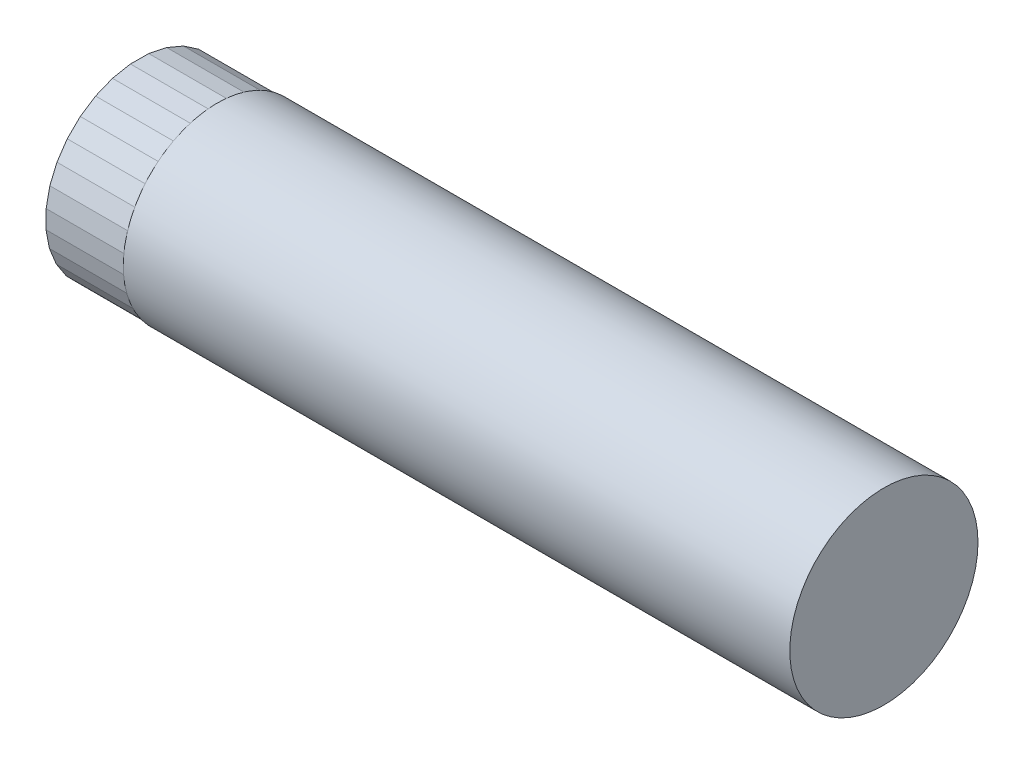
ISO-10303-21;
HEADER;
FILE_DESCRIPTION(('STEP AP214'),'2;1');
FILE_NAME('part.step','',(''),(''),'','','');
FILE_SCHEMA(('AUTOMOTIVE_DESIGN { 1 0 10303 214 1 1 1 1 }'));
ENDSEC;
DATA;
#1=APPLICATION_CONTEXT('core data for automotive mechanical design processes');
#2=APPLICATION_PROTOCOL_DEFINITION('international standard','automotive_design',2000,#1);
#3=PRODUCT_CONTEXT('',#1,'mechanical');
#4=PRODUCT('Part','Part','',(#3));
#5=PRODUCT_RELATED_PRODUCT_CATEGORY('part','',(#4));
#6=PRODUCT_DEFINITION_FORMATION('','',#4);
#7=PRODUCT_DEFINITION_CONTEXT('part definition',#1,'design');
#8=PRODUCT_DEFINITION('design','',#6,#7);
#9=PRODUCT_DEFINITION_SHAPE('','',#8);
#10=(LENGTH_UNIT() NAMED_UNIT(*) SI_UNIT(.MILLI.,.METRE.));
#11=(NAMED_UNIT(*) PLANE_ANGLE_UNIT() SI_UNIT($,.RADIAN.));
#12=(NAMED_UNIT(*) SI_UNIT($,.STERADIAN.) SOLID_ANGLE_UNIT());
#13=UNCERTAINTY_MEASURE_WITH_UNIT(LENGTH_MEASURE(1.E-05),#10,'distance_accuracy_value','');
#14=(GEOMETRIC_REPRESENTATION_CONTEXT(3) GLOBAL_UNCERTAINTY_ASSIGNED_CONTEXT((#13)) GLOBAL_UNIT_ASSIGNED_CONTEXT((#10,
#11,#12)) REPRESENTATION_CONTEXT('',''));
#15=CARTESIAN_POINT('',(0.,0.,0.));
#16=DIRECTION('',(0.,0.,1.));
#17=DIRECTION('',(1.,0.,0.));
#18=AXIS2_PLACEMENT_3D('',#15,#16,#17);
#19=CARTESIAN_POINT('',(0.,0.,0.));
#20=DIRECTION('',(1.,0.,0.));
#21=DIRECTION('',(0.,0.,-1.));
#22=AXIS2_PLACEMENT_3D('',#19,#20,#21);
#23=PLANE('',#22);
#24=CARTESIAN_POINT('',(0.,0.,0.));
#25=DIRECTION('',(1.,0.,0.));
#26=DIRECTION('',(0.,0.,-1.));
#27=AXIS2_PLACEMENT_3D('',#24,#25,#26);
#28=CIRCLE('',#27,6.);
#29=CARTESIAN_POINT('',(0.,0.,-6.));
#30=VERTEX_POINT('',#29);
#31=EDGE_CURVE('E45',#30,#30,#28,.T.);
#32=ORIENTED_EDGE('',*,*,#31,.F.);
#33=EDGE_LOOP('',(#32));
#34=FACE_BOUND('',#33,.T.);
#35=DIRECTION('',(0.,-0.979272733016625,0.202546079621773));
#36=VECTOR('',#35,1.);
#37=CARTESIAN_POINT('',(0.,-0.627894725384753,-5.9135621876609));
#38=LINE('',#37,#36);
#39=CARTESIAN_POINT('',(0.,-0.627894725384753,-5.9135621876609));
#40=VERTEX_POINT('',#39);
#41=CARTESIAN_POINT('',(0.,-1.76950865575336,-5.6774385642394));
#42=VERTEX_POINT('',#41);
#43=EDGE_CURVE('E270',#40,#42,#38,.T.);
#44=ORIENTED_EDGE('',*,*,#43,.F.);
#45=DIRECTION('',(0.,-0.999971061939465,0.00760758067058654));
#46=VECTOR('',#45,1.);
#47=CARTESIAN_POINT('',(0.,0.537848847152972,-5.92243093257448));
#48=LINE('',#47,#46);
#49=CARTESIAN_POINT('',(0.,0.537848847152972,-5.92243093257448));
#50=VERTEX_POINT('',#49);
#51=EDGE_CURVE('E267',#50,#40,#48,.T.);
#52=ORIENTED_EDGE('',*,*,#51,.F.);
#53=DIRECTION('',(0.,-0.982241063742202,-0.187623273339388));
#54=VECTOR('',#53,1.);
#55=CARTESIAN_POINT('',(0.,1.68292319012372,-5.70370397808675));
#56=LINE('',#55,#54);
#57=CARTESIAN_POINT('',(0.,1.68292319012372,-5.70370397808675));
#58=VERTEX_POINT('',#57);
#59=EDGE_CURVE('E366',#58,#50,#56,.T.);
#60=ORIENTED_EDGE('',*,*,#59,.F.);
#61=DIRECTION('',(0.,-0.926764092312462,-0.375643870175273));
#62=VECTOR('',#61,1.);
#63=CARTESIAN_POINT('',(0.,2.7633237386922,-5.26578687839519));
#64=LINE('',#63,#62);
#65=CARTESIAN_POINT('',(0.,2.7633237386922,-5.26578687839519));
#66=VERTEX_POINT('',#65);
#67=EDGE_CURVE('E369',#66,#58,#64,.T.);
#68=ORIENTED_EDGE('',*,*,#67,.F.);
#69=DIRECTION('',(0.,-0.835672096550445,-0.549228683743833));
#70=VECTOR('',#69,1.);
#71=CARTESIAN_POINT('',(0.,3.73753130567255,-4.62550854205421));
#72=LINE('',#71,#70);
#73=CARTESIAN_POINT('',(0.,3.73753130567255,-4.62550854205421));
#74=VERTEX_POINT('',#73);
#75=EDGE_CURVE('E372',#74,#66,#72,.T.);
#76=ORIENTED_EDGE('',*,*,#75,.F.);
#77=DIRECTION('',(0.,-0.712465690768305,-0.701706947007112));
#78=VECTOR('',#77,1.);
#79=CARTESIAN_POINT('',(0.,4.56810764060761,-3.80747450645715));
#80=LINE('',#79,#78);
#81=CARTESIAN_POINT('',(0.,4.56810764060761,-3.80747450645716));
#82=VERTEX_POINT('',#81);
#83=EDGE_CURVE('E375',#82,#74,#80,.T.);
#84=ORIENTED_EDGE('',*,*,#83,.F.);
#85=DIRECTION('',(0.,-0.561879628045302,-0.827219005818697));
#86=VECTOR('',#85,1.);
#87=CARTESIAN_POINT('',(0.,5.2231341607384,-2.84312136083325));
#88=LINE('',#87,#86);
#89=CARTESIAN_POINT('',(0.,5.2231341607384,-2.84312136083325));
#90=VERTEX_POINT('',#89);
#91=EDGE_CURVE('E378',#90,#82,#88,.T.);
#92=ORIENTED_EDGE('',*,*,#91,.F.);
#93=DIRECTION('',(0.,-0.389700846322243,-0.920941502146433));
#94=VECTOR('',#93,1.);
#95=CARTESIAN_POINT('',(0.,5.6774385642394,-1.76950865575336));
#96=LINE('',#95,#94);
#97=CARTESIAN_POINT('',(0.,5.6774385642394,-1.76950865575336));
#98=VERTEX_POINT('',#97);
#99=EDGE_CURVE('E381',#98,#90,#96,.T.);
#100=ORIENTED_EDGE('',*,*,#99,.F.);
#101=DIRECTION('',(0.,-0.202546079621773,-0.979272733016625));
#102=VECTOR('',#101,1.);
#103=CARTESIAN_POINT('',(0.,5.9135621876609,-0.627894725384767));
#104=LINE('',#103,#102);
#105=CARTESIAN_POINT('',(0.,5.9135621876609,-0.627894725384767));
#106=VERTEX_POINT('',#105);
#107=EDGE_CURVE('E384',#106,#98,#104,.T.);
#108=ORIENTED_EDGE('',*,*,#107,.F.);
#109=DIRECTION('',(0.,-0.00760758067059024,-0.999971061939465));
#110=VECTOR('',#109,1.);
#111=CARTESIAN_POINT('',(0.,5.92243093257448,0.537848847152962));
#112=LINE('',#111,#110);
#113=CARTESIAN_POINT('',(0.,5.92243093257448,0.537848847152962));
#114=VERTEX_POINT('',#113);
#115=EDGE_CURVE('E387',#114,#106,#112,.T.);
#116=ORIENTED_EDGE('',*,*,#115,.F.);
#117=DIRECTION('',(0.,0.187623273339388,-0.982241063742202));
#118=VECTOR('',#117,1.);
#119=CARTESIAN_POINT('',(0.,5.70370397808675,1.6829231901237));
#120=LINE('',#119,#118);
#121=CARTESIAN_POINT('',(0.,5.70370397808675,1.6829231901237));
#122=VERTEX_POINT('',#121);
#123=EDGE_CURVE('E390',#122,#114,#120,.T.);
#124=ORIENTED_EDGE('',*,*,#123,.F.);
#125=DIRECTION('',(0.,0.375643870175273,-0.926764092312462));
#126=VECTOR('',#125,1.);
#127=CARTESIAN_POINT('',(0.,5.26578687839519,2.7633237386922));
#128=LINE('',#127,#126);
#129=CARTESIAN_POINT('',(0.,5.26578687839519,2.7633237386922));
#130=VERTEX_POINT('',#129);
#131=EDGE_CURVE('E393',#130,#122,#128,.T.);
#132=ORIENTED_EDGE('',*,*,#131,.F.);
#133=DIRECTION('',(0.,0.549228683743834,-0.835672096550445));
#134=VECTOR('',#133,1.);
#135=CARTESIAN_POINT('',(0.,4.62550854205421,3.73753130567255));
#136=LINE('',#135,#134);
#137=CARTESIAN_POINT('',(0.,4.62550854205421,3.73753130567255));
#138=VERTEX_POINT('',#137);
#139=EDGE_CURVE('E396',#138,#130,#136,.T.);
#140=ORIENTED_EDGE('',*,*,#139,.F.);
#141=DIRECTION('',(0.,0.701706947007112,-0.712465690768305));
#142=VECTOR('',#141,1.);
#143=CARTESIAN_POINT('',(0.,3.80747450645715,4.56810764060761));
#144=LINE('',#143,#142);
#145=CARTESIAN_POINT('',(0.,3.80747450645716,4.56810764060761));
#146=VERTEX_POINT('',#145);
#147=EDGE_CURVE('E399',#146,#138,#144,.T.);
#148=ORIENTED_EDGE('',*,*,#147,.F.);
#149=DIRECTION('',(0.,0.827219005818697,-0.561879628045302));
#150=VECTOR('',#149,1.);
#151=CARTESIAN_POINT('',(0.,2.84312136083326,5.2231341607384));
#152=LINE('',#151,#150);
#153=CARTESIAN_POINT('',(0.,2.84312136083326,5.2231341607384));
#154=VERTEX_POINT('',#153);
#155=EDGE_CURVE('E402',#154,#146,#152,.T.);
#156=ORIENTED_EDGE('',*,*,#155,.F.);
#157=DIRECTION('',(0.,0.920941502146432,-0.389700846322244));
#158=VECTOR('',#157,1.);
#159=CARTESIAN_POINT('',(0.,1.76950865575337,5.6774385642394));
#160=LINE('',#159,#158);
#161=CARTESIAN_POINT('',(0.,1.76950865575337,5.6774385642394));
#162=VERTEX_POINT('',#161);
#163=EDGE_CURVE('E405',#162,#154,#160,.T.);
#164=ORIENTED_EDGE('',*,*,#163,.F.);
#165=DIRECTION('',(0.,0.979272733016625,-0.202546079621773));
#166=VECTOR('',#165,1.);
#167=CARTESIAN_POINT('',(0.,0.627894725384773,5.9135621876609));
#168=LINE('',#167,#166);
#169=CARTESIAN_POINT('',(0.,0.627894725384773,5.9135621876609));
#170=VERTEX_POINT('',#169);
#171=EDGE_CURVE('E408',#170,#162,#168,.T.);
#172=ORIENTED_EDGE('',*,*,#171,.F.);
#173=DIRECTION('',(0.,0.999971061939465,-0.00760758067059092));
#174=VECTOR('',#173,1.);
#175=CARTESIAN_POINT('',(0.,-0.537848847152966,5.92243093257448));
#176=LINE('',#175,#174);
#177=CARTESIAN_POINT('',(0.,-0.537848847152966,5.92243093257448));
#178=VERTEX_POINT('',#177);
#179=EDGE_CURVE('E411',#178,#170,#176,.T.);
#180=ORIENTED_EDGE('',*,*,#179,.F.);
#181=DIRECTION('',(0.,0.982241063742203,0.187623273339387));
#182=VECTOR('',#181,1.);
#183=CARTESIAN_POINT('',(0.,-1.68292319012371,5.70370397808675));
#184=LINE('',#183,#182);
#185=CARTESIAN_POINT('',(0.,-1.68292319012371,5.70370397808675));
#186=VERTEX_POINT('',#185);
#187=EDGE_CURVE('E414',#186,#178,#184,.T.);
#188=ORIENTED_EDGE('',*,*,#187,.F.);
#189=DIRECTION('',(0.,0.926764092312462,0.375643870175274));
#190=VECTOR('',#189,1.);
#191=CARTESIAN_POINT('',(0.,-2.76332373869219,5.26578687839519));
#192=LINE('',#191,#190);
#193=CARTESIAN_POINT('',(0.,-2.76332373869219,5.26578687839519));
#194=VERTEX_POINT('',#193);
#195=EDGE_CURVE('E417',#194,#186,#192,.T.);
#196=ORIENTED_EDGE('',*,*,#195,.F.);
#197=DIRECTION('',(0.,0.835672096550446,0.549228683743832));
#198=VECTOR('',#197,1.);
#199=CARTESIAN_POINT('',(0.,-3.73753130567255,4.6255085420542));
#200=LINE('',#199,#198);
#201=CARTESIAN_POINT('',(0.,-3.73753130567255,4.6255085420542));
#202=VERTEX_POINT('',#201);
#203=EDGE_CURVE('E420',#202,#194,#200,.T.);
#204=ORIENTED_EDGE('',*,*,#203,.F.);
#205=DIRECTION('',(0.,0.712465690768306,0.701706947007111));
#206=VECTOR('',#205,1.);
#207=CARTESIAN_POINT('',(0.,-4.5681076406076,3.80747450645717));
#208=LINE('',#207,#206);
#209=CARTESIAN_POINT('',(0.,-4.5681076406076,3.80747450645717));
#210=VERTEX_POINT('',#209);
#211=EDGE_CURVE('E423',#210,#202,#208,.T.);
#212=ORIENTED_EDGE('',*,*,#211,.F.);
#213=DIRECTION('',(0.,0.561879628045305,0.827219005818695));
#214=VECTOR('',#213,1.);
#215=CARTESIAN_POINT('',(0.,-5.22313416073839,2.84312136083328));
#216=LINE('',#215,#214);
#217=CARTESIAN_POINT('',(0.,-5.22313416073839,2.84312136083328));
#218=VERTEX_POINT('',#217);
#219=EDGE_CURVE('E426',#218,#210,#216,.T.);
#220=ORIENTED_EDGE('',*,*,#219,.F.);
#221=DIRECTION('',(0.,0.389700846322246,0.920941502146431));
#222=VECTOR('',#221,1.);
#223=CARTESIAN_POINT('',(0.,-5.67743856423939,1.76950865575338));
#224=LINE('',#223,#222);
#225=CARTESIAN_POINT('',(0.,-5.67743856423939,1.76950865575338));
#226=VERTEX_POINT('',#225);
#227=EDGE_CURVE('E429',#226,#218,#224,.T.);
#228=ORIENTED_EDGE('',*,*,#227,.F.);
#229=DIRECTION('',(0.,0.202546079621776,0.979272733016624));
#230=VECTOR('',#229,1.);
#231=CARTESIAN_POINT('',(0.,-5.9135621876609,0.627894725384774));
#232=LINE('',#231,#230);
#233=CARTESIAN_POINT('',(0.,-5.9135621876609,0.627894725384774));
#234=VERTEX_POINT('',#233);
#235=EDGE_CURVE('E432',#234,#226,#232,.T.);
#236=ORIENTED_EDGE('',*,*,#235,.F.);
#237=DIRECTION('',(0.,0.00760758067059026,0.999971061939465));
#238=VECTOR('',#237,1.);
#239=CARTESIAN_POINT('',(0.,-5.92243093257448,-0.537848847152952));
#240=LINE('',#239,#238);
#241=CARTESIAN_POINT('',(0.,-5.92243093257448,-0.537848847152952));
#242=VERTEX_POINT('',#241);
#243=EDGE_CURVE('E435',#242,#234,#240,.T.);
#244=ORIENTED_EDGE('',*,*,#243,.F.);
#245=DIRECTION('',(0.,-0.187623273339384,0.982241063742203));
#246=VECTOR('',#245,1.);
#247=CARTESIAN_POINT('',(0.,-5.70370397808675,-1.6829231901237));
#248=LINE('',#247,#246);
#249=CARTESIAN_POINT('',(0.,-5.70370397808675,-1.6829231901237));
#250=VERTEX_POINT('',#249);
#251=EDGE_CURVE('E438',#250,#242,#248,.T.);
#252=ORIENTED_EDGE('',*,*,#251,.F.);
#253=DIRECTION('',(0.,-0.375643870175272,0.926764092312463));
#254=VECTOR('',#253,1.);
#255=CARTESIAN_POINT('',(0.,-5.26578687839519,-2.76332373869219));
#256=LINE('',#255,#254);
#257=CARTESIAN_POINT('',(0.,-5.26578687839519,-2.76332373869219));
#258=VERTEX_POINT('',#257);
#259=EDGE_CURVE('E441',#258,#250,#256,.T.);
#260=ORIENTED_EDGE('',*,*,#259,.F.);
#261=DIRECTION('',(0.,-0.549228683743833,0.835672096550445));
#262=VECTOR('',#261,1.);
#263=CARTESIAN_POINT('',(0.,-4.62550854205421,-3.73753130567255));
#264=LINE('',#263,#262);
#265=CARTESIAN_POINT('',(0.,-4.62550854205421,-3.73753130567255));
#266=VERTEX_POINT('',#265);
#267=EDGE_CURVE('E444',#266,#258,#264,.T.);
#268=ORIENTED_EDGE('',*,*,#267,.F.);
#269=DIRECTION('',(0.,-0.701706947007111,0.712465690768306));
#270=VECTOR('',#269,1.);
#271=CARTESIAN_POINT('',(0.,-3.80747450645716,-4.56810764060761));
#272=LINE('',#271,#270);
#273=CARTESIAN_POINT('',(0.,-3.80747450645716,-4.56810764060761));
#274=VERTEX_POINT('',#273);
#275=EDGE_CURVE('E447',#274,#266,#272,.T.);
#276=ORIENTED_EDGE('',*,*,#275,.F.);
#277=DIRECTION('',(0.,-0.827219005818697,0.561879628045302));
#278=VECTOR('',#277,1.);
#279=CARTESIAN_POINT('',(0.,-2.84312136083326,-5.2231341607384));
#280=LINE('',#279,#278);
#281=CARTESIAN_POINT('',(0.,-2.84312136083326,-5.2231341607384));
#282=VERTEX_POINT('',#281);
#283=EDGE_CURVE('E61',#282,#274,#280,.T.);
#284=ORIENTED_EDGE('',*,*,#283,.F.);
#285=DIRECTION('',(0.,-0.920941502146433,0.389700846322243));
#286=VECTOR('',#285,1.);
#287=CARTESIAN_POINT('',(0.,-1.76950865575336,-5.6774385642394));
#288=LINE('',#287,#286);
#289=EDGE_CURVE('E56',#42,#282,#288,.T.);
#290=ORIENTED_EDGE('',*,*,#289,.F.);
#291=EDGE_LOOP('',(#44,#52,#60,#68,#76,#84,#92,#100,#108,#116,#124,#132,#140,#148,#156,#164,
#172,#180,#188,#196,#204,#212,#220,#228,#236,#244,#252,#260,#268,#276,#284,#290));
#292=FACE_BOUND('',#291,.T.);
#293=ADVANCED_FACE('F41',(#34,#292),#23,.F.);
#294=CARTESIAN_POINT('',(42.5,0.,0.));
#295=DIRECTION('',(-1.,0.,0.));
#296=DIRECTION('',(0.,0.,1.));
#297=AXIS2_PLACEMENT_3D('',#294,#295,#296);
#298=CYLINDRICAL_SURFACE('',#297,6.);
#299=CARTESIAN_POINT('',(42.5,0.,0.));
#300=DIRECTION('',(1.,0.,0.));
#301=DIRECTION('',(0.,0.,-1.));
#302=AXIS2_PLACEMENT_3D('',#299,#300,#301);
#303=CIRCLE('',#302,6.);
#304=CARTESIAN_POINT('',(42.5,0.,-6.));
#305=VERTEX_POINT('',#304);
#306=EDGE_CURVE('E11',#305,#305,#303,.T.);
#307=ORIENTED_EDGE('',*,*,#306,.F.);
#308=EDGE_LOOP('',(#307));
#309=FACE_BOUND('',#308,.T.);
#310=ORIENTED_EDGE('',*,*,#31,.T.);
#311=EDGE_LOOP('',(#310));
#312=FACE_BOUND('',#311,.T.);
#313=ADVANCED_FACE('F43',(#309,#312),#298,.T.);
#314=CARTESIAN_POINT('',(42.5,0.,0.));
#315=DIRECTION('',(1.,0.,0.));
#316=DIRECTION('',(0.,0.,-1.));
#317=AXIS2_PLACEMENT_3D('',#314,#315,#316);
#318=PLANE('',#317);
#319=ORIENTED_EDGE('',*,*,#306,.T.);
#320=EDGE_LOOP('',(#319));
#321=FACE_BOUND('',#320,.T.);
#322=ADVANCED_FACE('F634',(#321),#318,.T.);
#323=CARTESIAN_POINT('',(-5.,-0.627894725384753,-5.9135621876609));
#324=DIRECTION('',(0.,0.202546079621773,0.979272733016625));
#325=DIRECTION('',(0.,-0.979272733016625,0.202546079621773));
#326=AXIS2_PLACEMENT_3D('',#323,#324,#325);
#327=PLANE('',#326);
#328=ORIENTED_EDGE('',*,*,#43,.T.);
#329=DIRECTION('',(1.,0.,0.));
#330=VECTOR('',#329,1.);
#331=CARTESIAN_POINT('',(-5.,-1.76950865575336,-5.6774385642394));
#332=LINE('',#331,#330);
#333=CARTESIAN_POINT('',(-5.,-1.76950865575336,-5.6774385642394));
#334=VERTEX_POINT('',#333);
#335=EDGE_CURVE('E251',#334,#42,#332,.T.);
#336=ORIENTED_EDGE('',*,*,#335,.F.);
#337=DIRECTION('',(0.,-0.979272733016625,0.202546079621773));
#338=VECTOR('',#337,1.);
#339=CARTESIAN_POINT('',(-5.,-0.627894725384753,-5.9135621876609));
#340=LINE('',#339,#338);
#341=CARTESIAN_POINT('',(-5.,-0.627894725384753,-5.9135621876609));
#342=VERTEX_POINT('',#341);
#343=EDGE_CURVE('E258',#342,#334,#340,.T.);
#344=ORIENTED_EDGE('',*,*,#343,.F.);
#345=DIRECTION('',(1.,0.,0.));
#346=VECTOR('',#345,1.);
#347=CARTESIAN_POINT('',(-5.,-0.627894725384753,-5.9135621876609));
#348=LINE('',#347,#346);
#349=EDGE_CURVE('E362',#342,#40,#348,.T.);
#350=ORIENTED_EDGE('',*,*,#349,.T.);
#351=EDGE_LOOP('',(#328,#336,#344,#350));
#352=FACE_BOUND('',#351,.T.);
#353=ADVANCED_FACE('F269',(#352),#327,.F.);
#354=CARTESIAN_POINT('',(-5.,-1.76950865575336,-5.6774385642394));
#355=DIRECTION('',(0.,0.389700846322243,0.920941502146433));
#356=DIRECTION('',(0.,-0.920941502146433,0.389700846322243));
#357=AXIS2_PLACEMENT_3D('',#354,#355,#356);
#358=PLANE('',#357);
#359=ORIENTED_EDGE('',*,*,#289,.T.);
#360=DIRECTION('',(1.,0.,0.));
#361=VECTOR('',#360,1.);
#362=CARTESIAN_POINT('',(-5.,-2.84312136083326,-5.2231341607384));
#363=LINE('',#362,#361);
#364=CARTESIAN_POINT('',(-5.,-2.84312136083326,-5.2231341607384));
#365=VERTEX_POINT('',#364);
#366=EDGE_CURVE('E254',#365,#282,#363,.T.);
#367=ORIENTED_EDGE('',*,*,#366,.F.);
#368=DIRECTION('',(0.,-0.920941502146433,0.389700846322243));
#369=VECTOR('',#368,1.);
#370=CARTESIAN_POINT('',(-5.,-1.76950865575336,-5.6774385642394));
#371=LINE('',#370,#369);
#372=EDGE_CURVE('E247',#334,#365,#371,.T.);
#373=ORIENTED_EDGE('',*,*,#372,.F.);
#374=ORIENTED_EDGE('',*,*,#335,.T.);
#375=EDGE_LOOP('',(#359,#367,#373,#374));
#376=FACE_BOUND('',#375,.T.);
#377=ADVANCED_FACE('F249',(#376),#358,.F.);
#378=CARTESIAN_POINT('',(-5.,-2.84312136083326,-5.2231341607384));
#379=DIRECTION('',(0.,0.561879628045302,0.827219005818697));
#380=DIRECTION('',(0.,-0.827219005818697,0.561879628045302));
#381=AXIS2_PLACEMENT_3D('',#378,#379,#380);
#382=PLANE('',#381);
#383=ORIENTED_EDGE('',*,*,#283,.T.);
#384=DIRECTION('',(1.,0.,0.));
#385=VECTOR('',#384,1.);
#386=CARTESIAN_POINT('',(-5.,-3.80747450645716,-4.56810764060761));
#387=LINE('',#386,#385);
#388=CARTESIAN_POINT('',(-5.,-3.80747450645716,-4.56810764060761));
#389=VERTEX_POINT('',#388);
#390=EDGE_CURVE('E273',#389,#274,#387,.T.);
#391=ORIENTED_EDGE('',*,*,#390,.F.);
#392=DIRECTION('',(0.,-0.827219005818697,0.561879628045302));
#393=VECTOR('',#392,1.);
#394=CARTESIAN_POINT('',(-5.,-2.84312136083326,-5.2231341607384));
#395=LINE('',#394,#393);
#396=EDGE_CURVE('E257',#365,#389,#395,.T.);
#397=ORIENTED_EDGE('',*,*,#396,.F.);
#398=ORIENTED_EDGE('',*,*,#366,.T.);
#399=EDGE_LOOP('',(#383,#391,#397,#398));
#400=FACE_BOUND('',#399,.T.);
#401=ADVANCED_FACE('F514',(#400),#382,.F.);
#402=CARTESIAN_POINT('',(-5.,-3.80747450645716,-4.56810764060761));
#403=DIRECTION('',(0.,0.712465690768306,0.701706947007111));
#404=DIRECTION('',(0.,-0.701706947007111,0.712465690768306));
#405=AXIS2_PLACEMENT_3D('',#402,#403,#404);
#406=PLANE('',#405);
#407=ORIENTED_EDGE('',*,*,#275,.T.);
#408=DIRECTION('',(1.,0.,0.));
#409=VECTOR('',#408,1.);
#410=CARTESIAN_POINT('',(-5.,-4.62550854205421,-3.73753130567255));
#411=LINE('',#410,#409);
#412=CARTESIAN_POINT('',(-5.,-4.62550854205421,-3.73753130567255));
#413=VERTEX_POINT('',#412);
#414=EDGE_CURVE('E278',#413,#266,#411,.T.);
#415=ORIENTED_EDGE('',*,*,#414,.F.);
#416=DIRECTION('',(0.,-0.701706947007111,0.712465690768306));
#417=VECTOR('',#416,1.);
#418=CARTESIAN_POINT('',(-5.,-3.80747450645716,-4.56810764060761));
#419=LINE('',#418,#417);
#420=EDGE_CURVE('E508',#389,#413,#419,.T.);
#421=ORIENTED_EDGE('',*,*,#420,.F.);
#422=ORIENTED_EDGE('',*,*,#390,.T.);
#423=EDGE_LOOP('',(#407,#415,#421,#422));
#424=FACE_BOUND('',#423,.T.);
#425=ADVANCED_FACE('F516',(#424),#406,.F.);
#426=CARTESIAN_POINT('',(-5.,-4.62550854205421,-3.73753130567255));
#427=DIRECTION('',(0.,0.835672096550445,0.549228683743833));
#428=DIRECTION('',(0.,-0.549228683743833,0.835672096550445));
#429=AXIS2_PLACEMENT_3D('',#426,#427,#428);
#430=PLANE('',#429);
#431=ORIENTED_EDGE('',*,*,#267,.T.);
#432=DIRECTION('',(1.,0.,0.));
#433=VECTOR('',#432,1.);
#434=CARTESIAN_POINT('',(-5.,-5.26578687839519,-2.76332373869219));
#435=LINE('',#434,#433);
#436=CARTESIAN_POINT('',(-5.,-5.26578687839519,-2.76332373869219));
#437=VERTEX_POINT('',#436);
#438=EDGE_CURVE('E281',#437,#258,#435,.T.);
#439=ORIENTED_EDGE('',*,*,#438,.F.);
#440=DIRECTION('',(0.,-0.549228683743833,0.835672096550445));
#441=VECTOR('',#440,1.);
#442=CARTESIAN_POINT('',(-5.,-4.62550854205421,-3.73753130567255));
#443=LINE('',#442,#441);
#444=EDGE_CURVE('E506',#413,#437,#443,.T.);
#445=ORIENTED_EDGE('',*,*,#444,.F.);
#446=ORIENTED_EDGE('',*,*,#414,.T.);
#447=EDGE_LOOP('',(#431,#439,#445,#446));
#448=FACE_BOUND('',#447,.T.);
#449=ADVANCED_FACE('F520',(#448),#430,.F.);
#450=CARTESIAN_POINT('',(-5.,-5.26578687839519,-2.76332373869219));
#451=DIRECTION('',(0.,0.926764092312463,0.375643870175272));
#452=DIRECTION('',(0.,-0.375643870175272,0.926764092312463));
#453=AXIS2_PLACEMENT_3D('',#450,#451,#452);
#454=PLANE('',#453);
#455=ORIENTED_EDGE('',*,*,#259,.T.);
#456=DIRECTION('',(1.,0.,0.));
#457=VECTOR('',#456,1.);
#458=CARTESIAN_POINT('',(-5.,-5.70370397808675,-1.6829231901237));
#459=LINE('',#458,#457);
#460=CARTESIAN_POINT('',(-5.,-5.70370397808675,-1.6829231901237));
#461=VERTEX_POINT('',#460);
#462=EDGE_CURVE('E284',#461,#250,#459,.T.);
#463=ORIENTED_EDGE('',*,*,#462,.F.);
#464=DIRECTION('',(0.,-0.375643870175272,0.926764092312463));
#465=VECTOR('',#464,1.);
#466=CARTESIAN_POINT('',(-5.,-5.26578687839519,-2.76332373869219));
#467=LINE('',#466,#465);
#468=EDGE_CURVE('E504',#437,#461,#467,.T.);
#469=ORIENTED_EDGE('',*,*,#468,.F.);
#470=ORIENTED_EDGE('',*,*,#438,.T.);
#471=EDGE_LOOP('',(#455,#463,#469,#470));
#472=FACE_BOUND('',#471,.T.);
#473=ADVANCED_FACE('F526',(#472),#454,.F.);
#474=CARTESIAN_POINT('',(-5.,-5.70370397808675,-1.6829231901237));
#475=DIRECTION('',(0.,0.982241063742203,0.187623273339384));
#476=DIRECTION('',(0.,-0.187623273339384,0.982241063742203));
#477=AXIS2_PLACEMENT_3D('',#474,#475,#476);
#478=PLANE('',#477);
#479=ORIENTED_EDGE('',*,*,#251,.T.);
#480=DIRECTION('',(1.,0.,0.));
#481=VECTOR('',#480,1.);
#482=CARTESIAN_POINT('',(-5.,-5.92243093257448,-0.537848847152952));
#483=LINE('',#482,#481);
#484=CARTESIAN_POINT('',(-5.,-5.92243093257448,-0.537848847152952));
#485=VERTEX_POINT('',#484);
#486=EDGE_CURVE('E287',#485,#242,#483,.T.);
#487=ORIENTED_EDGE('',*,*,#486,.F.);
#488=DIRECTION('',(0.,-0.187623273339384,0.982241063742203));
#489=VECTOR('',#488,1.);
#490=CARTESIAN_POINT('',(-5.,-5.70370397808675,-1.6829231901237));
#491=LINE('',#490,#489);
#492=EDGE_CURVE('E502',#461,#485,#491,.T.);
#493=ORIENTED_EDGE('',*,*,#492,.F.);
#494=ORIENTED_EDGE('',*,*,#462,.T.);
#495=EDGE_LOOP('',(#479,#487,#493,#494));
#496=FACE_BOUND('',#495,.T.);
#497=ADVANCED_FACE('F528',(#496),#478,.F.);
#498=CARTESIAN_POINT('',(-5.,-5.92243093257448,-0.537848847152952));
#499=DIRECTION('',(0.,0.999971061939465,-0.00760758067059026));
#500=DIRECTION('',(0.,0.00760758067059026,0.999971061939465));
#501=AXIS2_PLACEMENT_3D('',#498,#499,#500);
#502=PLANE('',#501);
#503=ORIENTED_EDGE('',*,*,#243,.T.);
#504=DIRECTION('',(1.,0.,0.));
#505=VECTOR('',#504,1.);
#506=CARTESIAN_POINT('',(-5.,-5.9135621876609,0.627894725384774));
#507=LINE('',#506,#505);
#508=CARTESIAN_POINT('',(-5.,-5.9135621876609,0.627894725384774));
#509=VERTEX_POINT('',#508);
#510=EDGE_CURVE('E290',#509,#234,#507,.T.);
#511=ORIENTED_EDGE('',*,*,#510,.F.);
#512=DIRECTION('',(0.,0.00760758067059026,0.999971061939465));
#513=VECTOR('',#512,1.);
#514=CARTESIAN_POINT('',(-5.,-5.92243093257448,-0.537848847152952));
#515=LINE('',#514,#513);
#516=EDGE_CURVE('E500',#485,#509,#515,.T.);
#517=ORIENTED_EDGE('',*,*,#516,.F.);
#518=ORIENTED_EDGE('',*,*,#486,.T.);
#519=EDGE_LOOP('',(#503,#511,#517,#518));
#520=FACE_BOUND('',#519,.T.);
#521=ADVANCED_FACE('F532',(#520),#502,.F.);
#522=CARTESIAN_POINT('',(-5.,-5.9135621876609,0.627894725384774));
#523=DIRECTION('',(0.,0.979272733016624,-0.202546079621776));
#524=DIRECTION('',(0.,0.202546079621776,0.979272733016625));
#525=AXIS2_PLACEMENT_3D('',#522,#523,#524);
#526=PLANE('',#525);
#527=ORIENTED_EDGE('',*,*,#235,.T.);
#528=DIRECTION('',(1.,0.,0.));
#529=VECTOR('',#528,1.);
#530=CARTESIAN_POINT('',(-5.,-5.67743856423939,1.76950865575338));
#531=LINE('',#530,#529);
#532=CARTESIAN_POINT('',(-5.,-5.67743856423939,1.76950865575338));
#533=VERTEX_POINT('',#532);
#534=EDGE_CURVE('E293',#533,#226,#531,.T.);
#535=ORIENTED_EDGE('',*,*,#534,.F.);
#536=DIRECTION('',(0.,0.202546079621776,0.979272733016624));
#537=VECTOR('',#536,1.);
#538=CARTESIAN_POINT('',(-5.,-5.9135621876609,0.627894725384774));
#539=LINE('',#538,#537);
#540=EDGE_CURVE('E498',#509,#533,#539,.T.);
#541=ORIENTED_EDGE('',*,*,#540,.F.);
#542=ORIENTED_EDGE('',*,*,#510,.T.);
#543=EDGE_LOOP('',(#527,#535,#541,#542));
#544=FACE_BOUND('',#543,.T.);
#545=ADVANCED_FACE('F538',(#544),#526,.F.);
#546=CARTESIAN_POINT('',(-5.,-5.67743856423939,1.76950865575338));
#547=DIRECTION('',(0.,0.920941502146431,-0.389700846322246));
#548=DIRECTION('',(0.,0.389700846322246,0.920941502146431));
#549=AXIS2_PLACEMENT_3D('',#546,#547,#548);
#550=PLANE('',#549);
#551=ORIENTED_EDGE('',*,*,#227,.T.);
#552=DIRECTION('',(1.,0.,0.));
#553=VECTOR('',#552,1.);
#554=CARTESIAN_POINT('',(-5.,-5.22313416073839,2.84312136083328));
#555=LINE('',#554,#553);
#556=CARTESIAN_POINT('',(-5.,-5.22313416073839,2.84312136083328));
#557=VERTEX_POINT('',#556);
#558=EDGE_CURVE('E296',#557,#218,#555,.T.);
#559=ORIENTED_EDGE('',*,*,#558,.F.);
#560=DIRECTION('',(0.,0.389700846322246,0.920941502146431));
#561=VECTOR('',#560,1.);
#562=CARTESIAN_POINT('',(-5.,-5.67743856423939,1.76950865575338));
#563=LINE('',#562,#561);
#564=EDGE_CURVE('E496',#533,#557,#563,.T.);
#565=ORIENTED_EDGE('',*,*,#564,.F.);
#566=ORIENTED_EDGE('',*,*,#534,.T.);
#567=EDGE_LOOP('',(#551,#559,#565,#566));
#568=FACE_BOUND('',#567,.T.);
#569=ADVANCED_FACE('F540',(#568),#550,.F.);
#570=CARTESIAN_POINT('',(-5.,-5.22313416073839,2.84312136083328));
#571=DIRECTION('',(0.,0.827219005818695,-0.561879628045305));
#572=DIRECTION('',(0.,0.561879628045305,0.827219005818695));
#573=AXIS2_PLACEMENT_3D('',#570,#571,#572);
#574=PLANE('',#573);
#575=ORIENTED_EDGE('',*,*,#219,.T.);
#576=DIRECTION('',(1.,0.,0.));
#577=VECTOR('',#576,1.);
#578=CARTESIAN_POINT('',(-5.,-4.5681076406076,3.80747450645717));
#579=LINE('',#578,#577);
#580=CARTESIAN_POINT('',(-5.,-4.5681076406076,3.80747450645717));
#581=VERTEX_POINT('',#580);
#582=EDGE_CURVE('E299',#581,#210,#579,.T.);
#583=ORIENTED_EDGE('',*,*,#582,.F.);
#584=DIRECTION('',(0.,0.561879628045305,0.827219005818695));
#585=VECTOR('',#584,1.);
#586=CARTESIAN_POINT('',(-5.,-5.22313416073839,2.84312136083328));
#587=LINE('',#586,#585);
#588=EDGE_CURVE('E494',#557,#581,#587,.T.);
#589=ORIENTED_EDGE('',*,*,#588,.F.);
#590=ORIENTED_EDGE('',*,*,#558,.T.);
#591=EDGE_LOOP('',(#575,#583,#589,#590));
#592=FACE_BOUND('',#591,.T.);
#593=ADVANCED_FACE('F544',(#592),#574,.F.);
#594=CARTESIAN_POINT('',(-5.,-4.5681076406076,3.80747450645717));
#595=DIRECTION('',(0.,0.701706947007111,-0.712465690768306));
#596=DIRECTION('',(0.,0.712465690768306,0.701706947007111));
#597=AXIS2_PLACEMENT_3D('',#594,#595,#596);
#598=PLANE('',#597);
#599=ORIENTED_EDGE('',*,*,#211,.T.);
#600=DIRECTION('',(1.,0.,0.));
#601=VECTOR('',#600,1.);
#602=CARTESIAN_POINT('',(-5.,-3.73753130567255,4.6255085420542));
#603=LINE('',#602,#601);
#604=CARTESIAN_POINT('',(-5.,-3.73753130567255,4.6255085420542));
#605=VERTEX_POINT('',#604);
#606=EDGE_CURVE('E302',#605,#202,#603,.T.);
#607=ORIENTED_EDGE('',*,*,#606,.F.);
#608=DIRECTION('',(0.,0.712465690768306,0.701706947007111));
#609=VECTOR('',#608,1.);
#610=CARTESIAN_POINT('',(-5.,-4.5681076406076,3.80747450645717));
#611=LINE('',#610,#609);
#612=EDGE_CURVE('E492',#581,#605,#611,.T.);
#613=ORIENTED_EDGE('',*,*,#612,.F.);
#614=ORIENTED_EDGE('',*,*,#582,.T.);
#615=EDGE_LOOP('',(#599,#607,#613,#614));
#616=FACE_BOUND('',#615,.T.);
#617=ADVANCED_FACE('F550',(#616),#598,.F.);
#618=CARTESIAN_POINT('',(-5.,-3.73753130567255,4.6255085420542));
#619=DIRECTION('',(0.,0.549228683743832,-0.835672096550446));
#620=DIRECTION('',(0.,0.835672096550446,0.549228683743832));
#621=AXIS2_PLACEMENT_3D('',#618,#619,#620);
#622=PLANE('',#621);
#623=ORIENTED_EDGE('',*,*,#203,.T.);
#624=DIRECTION('',(1.,0.,0.));
#625=VECTOR('',#624,1.);
#626=CARTESIAN_POINT('',(-5.,-2.76332373869219,5.26578687839519));
#627=LINE('',#626,#625);
#628=CARTESIAN_POINT('',(-5.,-2.76332373869219,5.26578687839519));
#629=VERTEX_POINT('',#628);
#630=EDGE_CURVE('E305',#629,#194,#627,.T.);
#631=ORIENTED_EDGE('',*,*,#630,.F.);
#632=DIRECTION('',(0.,0.835672096550446,0.549228683743832));
#633=VECTOR('',#632,1.);
#634=CARTESIAN_POINT('',(-5.,-3.73753130567255,4.6255085420542));
#635=LINE('',#634,#633);
#636=EDGE_CURVE('E490',#605,#629,#635,.T.);
#637=ORIENTED_EDGE('',*,*,#636,.F.);
#638=ORIENTED_EDGE('',*,*,#606,.T.);
#639=EDGE_LOOP('',(#623,#631,#637,#638));
#640=FACE_BOUND('',#639,.T.);
#641=ADVANCED_FACE('F552',(#640),#622,.F.);
#642=CARTESIAN_POINT('',(-5.,-2.76332373869219,5.26578687839519));
#643=DIRECTION('',(0.,0.375643870175274,-0.926764092312462));
#644=DIRECTION('',(0.,0.926764092312462,0.375643870175274));
#645=AXIS2_PLACEMENT_3D('',#642,#643,#644);
#646=PLANE('',#645);
#647=ORIENTED_EDGE('',*,*,#195,.T.);
#648=DIRECTION('',(1.,0.,0.));
#649=VECTOR('',#648,1.);
#650=CARTESIAN_POINT('',(-5.,-1.68292319012371,5.70370397808675));
#651=LINE('',#650,#649);
#652=CARTESIAN_POINT('',(-5.,-1.68292319012371,5.70370397808675));
#653=VERTEX_POINT('',#652);
#654=EDGE_CURVE('E308',#653,#186,#651,.T.);
#655=ORIENTED_EDGE('',*,*,#654,.F.);
#656=DIRECTION('',(0.,0.926764092312462,0.375643870175274));
#657=VECTOR('',#656,1.);
#658=CARTESIAN_POINT('',(-5.,-2.76332373869219,5.26578687839519));
#659=LINE('',#658,#657);
#660=EDGE_CURVE('E488',#629,#653,#659,.T.);
#661=ORIENTED_EDGE('',*,*,#660,.F.);
#662=ORIENTED_EDGE('',*,*,#630,.T.);
#663=EDGE_LOOP('',(#647,#655,#661,#662));
#664=FACE_BOUND('',#663,.T.);
#665=ADVANCED_FACE('F556',(#664),#646,.F.);
#666=CARTESIAN_POINT('',(-5.,-1.68292319012371,5.70370397808675));
#667=DIRECTION('',(0.,0.187623273339387,-0.982241063742203));
#668=DIRECTION('',(0.,0.982241063742203,0.187623273339387));
#669=AXIS2_PLACEMENT_3D('',#666,#667,#668);
#670=PLANE('',#669);
#671=ORIENTED_EDGE('',*,*,#187,.T.);
#672=DIRECTION('',(1.,0.,0.));
#673=VECTOR('',#672,1.);
#674=CARTESIAN_POINT('',(-5.,-0.537848847152966,5.92243093257448));
#675=LINE('',#674,#673);
#676=CARTESIAN_POINT('',(-5.,-0.537848847152966,5.92243093257448));
#677=VERTEX_POINT('',#676);
#678=EDGE_CURVE('E311',#677,#178,#675,.T.);
#679=ORIENTED_EDGE('',*,*,#678,.F.);
#680=DIRECTION('',(0.,0.982241063742203,0.187623273339387));
#681=VECTOR('',#680,1.);
#682=CARTESIAN_POINT('',(-5.,-1.68292319012371,5.70370397808675));
#683=LINE('',#682,#681);
#684=EDGE_CURVE('E486',#653,#677,#683,.T.);
#685=ORIENTED_EDGE('',*,*,#684,.F.);
#686=ORIENTED_EDGE('',*,*,#654,.T.);
#687=EDGE_LOOP('',(#671,#679,#685,#686));
#688=FACE_BOUND('',#687,.T.);
#689=ADVANCED_FACE('F562',(#688),#670,.F.);
#690=CARTESIAN_POINT('',(-5.,-0.537848847152966,5.92243093257448));
#691=DIRECTION('',(0.,-0.00760758067059092,-0.999971061939465));
#692=DIRECTION('',(0.,0.999971061939465,-0.00760758067059092));
#693=AXIS2_PLACEMENT_3D('',#690,#691,#692);
#694=PLANE('',#693);
#695=ORIENTED_EDGE('',*,*,#179,.T.);
#696=DIRECTION('',(1.,0.,0.));
#697=VECTOR('',#696,1.);
#698=CARTESIAN_POINT('',(-5.,0.627894725384773,5.9135621876609));
#699=LINE('',#698,#697);
#700=CARTESIAN_POINT('',(-5.,0.627894725384773,5.9135621876609));
#701=VERTEX_POINT('',#700);
#702=EDGE_CURVE('E314',#701,#170,#699,.T.);
#703=ORIENTED_EDGE('',*,*,#702,.F.);
#704=DIRECTION('',(0.,0.999971061939465,-0.00760758067059092));
#705=VECTOR('',#704,1.);
#706=CARTESIAN_POINT('',(-5.,-0.537848847152966,5.92243093257448));
#707=LINE('',#706,#705);
#708=EDGE_CURVE('E484',#677,#701,#707,.T.);
#709=ORIENTED_EDGE('',*,*,#708,.F.);
#710=ORIENTED_EDGE('',*,*,#678,.T.);
#711=EDGE_LOOP('',(#695,#703,#709,#710));
#712=FACE_BOUND('',#711,.T.);
#713=ADVANCED_FACE('F564',(#712),#694,.F.);
#714=CARTESIAN_POINT('',(-5.,0.627894725384773,5.9135621876609));
#715=DIRECTION('',(0.,-0.202546079621773,-0.979272733016625));
#716=DIRECTION('',(0.,0.979272733016625,-0.202546079621773));
#717=AXIS2_PLACEMENT_3D('',#714,#715,#716);
#718=PLANE('',#717);
#719=ORIENTED_EDGE('',*,*,#171,.T.);
#720=DIRECTION('',(1.,0.,0.));
#721=VECTOR('',#720,1.);
#722=CARTESIAN_POINT('',(-5.,1.76950865575337,5.6774385642394));
#723=LINE('',#722,#721);
#724=CARTESIAN_POINT('',(-5.,1.76950865575337,5.6774385642394));
#725=VERTEX_POINT('',#724);
#726=EDGE_CURVE('E317',#725,#162,#723,.T.);
#727=ORIENTED_EDGE('',*,*,#726,.F.);
#728=DIRECTION('',(0.,0.979272733016625,-0.202546079621773));
#729=VECTOR('',#728,1.);
#730=CARTESIAN_POINT('',(-5.,0.627894725384773,5.9135621876609));
#731=LINE('',#730,#729);
#732=EDGE_CURVE('E482',#701,#725,#731,.T.);
#733=ORIENTED_EDGE('',*,*,#732,.F.);
#734=ORIENTED_EDGE('',*,*,#702,.T.);
#735=EDGE_LOOP('',(#719,#727,#733,#734));
#736=FACE_BOUND('',#735,.T.);
#737=ADVANCED_FACE('F568',(#736),#718,.F.);
#738=CARTESIAN_POINT('',(-5.,1.76950865575337,5.6774385642394));
#739=DIRECTION('',(0.,-0.389700846322244,-0.920941502146432));
#740=DIRECTION('',(0.,0.920941502146432,-0.389700846322244));
#741=AXIS2_PLACEMENT_3D('',#738,#739,#740);
#742=PLANE('',#741);
#743=ORIENTED_EDGE('',*,*,#163,.T.);
#744=DIRECTION('',(1.,0.,0.));
#745=VECTOR('',#744,1.);
#746=CARTESIAN_POINT('',(-5.,2.84312136083326,5.2231341607384));
#747=LINE('',#746,#745);
#748=CARTESIAN_POINT('',(-5.,2.84312136083326,5.2231341607384));
#749=VERTEX_POINT('',#748);
#750=EDGE_CURVE('E320',#749,#154,#747,.T.);
#751=ORIENTED_EDGE('',*,*,#750,.F.);
#752=DIRECTION('',(0.,0.920941502146432,-0.389700846322244));
#753=VECTOR('',#752,1.);
#754=CARTESIAN_POINT('',(-5.,1.76950865575337,5.6774385642394));
#755=LINE('',#754,#753);
#756=EDGE_CURVE('E480',#725,#749,#755,.T.);
#757=ORIENTED_EDGE('',*,*,#756,.F.);
#758=ORIENTED_EDGE('',*,*,#726,.T.);
#759=EDGE_LOOP('',(#743,#751,#757,#758));
#760=FACE_BOUND('',#759,.T.);
#761=ADVANCED_FACE('F574',(#760),#742,.F.);
#762=CARTESIAN_POINT('',(-5.,2.84312136083326,5.2231341607384));
#763=DIRECTION('',(0.,-0.561879628045302,-0.827219005818697));
#764=DIRECTION('',(0.,0.827219005818697,-0.561879628045302));
#765=AXIS2_PLACEMENT_3D('',#762,#763,#764);
#766=PLANE('',#765);
#767=ORIENTED_EDGE('',*,*,#155,.T.);
#768=DIRECTION('',(1.,0.,0.));
#769=VECTOR('',#768,1.);
#770=CARTESIAN_POINT('',(-5.,3.80747450645715,4.56810764060761));
#771=LINE('',#770,#769);
#772=CARTESIAN_POINT('',(-5.,3.80747450645715,4.56810764060761));
#773=VERTEX_POINT('',#772);
#774=EDGE_CURVE('E323',#773,#146,#771,.T.);
#775=ORIENTED_EDGE('',*,*,#774,.F.);
#776=DIRECTION('',(0.,0.827219005818697,-0.561879628045302));
#777=VECTOR('',#776,1.);
#778=CARTESIAN_POINT('',(-5.,2.84312136083326,5.2231341607384));
#779=LINE('',#778,#777);
#780=EDGE_CURVE('E478',#749,#773,#779,.T.);
#781=ORIENTED_EDGE('',*,*,#780,.F.);
#782=ORIENTED_EDGE('',*,*,#750,.T.);
#783=EDGE_LOOP('',(#767,#775,#781,#782));
#784=FACE_BOUND('',#783,.T.);
#785=ADVANCED_FACE('F576',(#784),#766,.F.);
#786=CARTESIAN_POINT('',(-5.,3.80747450645715,4.56810764060761));
#787=DIRECTION('',(0.,-0.712465690768305,-0.701706947007112));
#788=DIRECTION('',(0.,0.701706947007112,-0.712465690768305));
#789=AXIS2_PLACEMENT_3D('',#786,#787,#788);
#790=PLANE('',#789);
#791=ORIENTED_EDGE('',*,*,#147,.T.);
#792=DIRECTION('',(1.,0.,0.));
#793=VECTOR('',#792,1.);
#794=CARTESIAN_POINT('',(-5.,4.62550854205421,3.73753130567255));
#795=LINE('',#794,#793);
#796=CARTESIAN_POINT('',(-5.,4.62550854205421,3.73753130567255));
#797=VERTEX_POINT('',#796);
#798=EDGE_CURVE('E326',#797,#138,#795,.T.);
#799=ORIENTED_EDGE('',*,*,#798,.F.);
#800=DIRECTION('',(0.,0.701706947007112,-0.712465690768305));
#801=VECTOR('',#800,1.);
#802=CARTESIAN_POINT('',(-5.,3.80747450645715,4.56810764060761));
#803=LINE('',#802,#801);
#804=EDGE_CURVE('E476',#773,#797,#803,.T.);
#805=ORIENTED_EDGE('',*,*,#804,.F.);
#806=ORIENTED_EDGE('',*,*,#774,.T.);
#807=EDGE_LOOP('',(#791,#799,#805,#806));
#808=FACE_BOUND('',#807,.T.);
#809=ADVANCED_FACE('F580',(#808),#790,.F.);
#810=CARTESIAN_POINT('',(-5.,4.62550854205421,3.73753130567255));
#811=DIRECTION('',(0.,-0.835672096550445,-0.549228683743834));
#812=DIRECTION('',(0.,0.549228683743834,-0.835672096550445));
#813=AXIS2_PLACEMENT_3D('',#810,#811,#812);
#814=PLANE('',#813);
#815=ORIENTED_EDGE('',*,*,#139,.T.);
#816=DIRECTION('',(1.,0.,0.));
#817=VECTOR('',#816,1.);
#818=CARTESIAN_POINT('',(-5.,5.26578687839519,2.7633237386922));
#819=LINE('',#818,#817);
#820=CARTESIAN_POINT('',(-5.,5.26578687839519,2.7633237386922));
#821=VERTEX_POINT('',#820);
#822=EDGE_CURVE('E329',#821,#130,#819,.T.);
#823=ORIENTED_EDGE('',*,*,#822,.F.);
#824=DIRECTION('',(0.,0.549228683743834,-0.835672096550445));
#825=VECTOR('',#824,1.);
#826=CARTESIAN_POINT('',(-5.,4.62550854205421,3.73753130567255));
#827=LINE('',#826,#825);
#828=EDGE_CURVE('E474',#797,#821,#827,.T.);
#829=ORIENTED_EDGE('',*,*,#828,.F.);
#830=ORIENTED_EDGE('',*,*,#798,.T.);
#831=EDGE_LOOP('',(#815,#823,#829,#830));
#832=FACE_BOUND('',#831,.T.);
#833=ADVANCED_FACE('F586',(#832),#814,.F.);
#834=CARTESIAN_POINT('',(-5.,5.26578687839519,2.7633237386922));
#835=DIRECTION('',(0.,-0.926764092312462,-0.375643870175273));
#836=DIRECTION('',(0.,0.375643870175274,-0.926764092312463));
#837=AXIS2_PLACEMENT_3D('',#834,#835,#836);
#838=PLANE('',#837);
#839=ORIENTED_EDGE('',*,*,#131,.T.);
#840=DIRECTION('',(1.,0.,0.));
#841=VECTOR('',#840,1.);
#842=CARTESIAN_POINT('',(-5.,5.70370397808675,1.6829231901237));
#843=LINE('',#842,#841);
#844=CARTESIAN_POINT('',(-5.,5.70370397808675,1.6829231901237));
#845=VERTEX_POINT('',#844);
#846=EDGE_CURVE('E332',#845,#122,#843,.T.);
#847=ORIENTED_EDGE('',*,*,#846,.F.);
#848=DIRECTION('',(0.,0.375643870175273,-0.926764092312462));
#849=VECTOR('',#848,1.);
#850=CARTESIAN_POINT('',(-5.,5.26578687839519,2.7633237386922));
#851=LINE('',#850,#849);
#852=EDGE_CURVE('E472',#821,#845,#851,.T.);
#853=ORIENTED_EDGE('',*,*,#852,.F.);
#854=ORIENTED_EDGE('',*,*,#822,.T.);
#855=EDGE_LOOP('',(#839,#847,#853,#854));
#856=FACE_BOUND('',#855,.T.);
#857=ADVANCED_FACE('F588',(#856),#838,.F.);
#858=CARTESIAN_POINT('',(-5.,5.70370397808675,1.6829231901237));
#859=DIRECTION('',(0.,-0.982241063742202,-0.187623273339388));
#860=DIRECTION('',(0.,0.187623273339388,-0.982241063742203));
#861=AXIS2_PLACEMENT_3D('',#858,#859,#860);
#862=PLANE('',#861);
#863=ORIENTED_EDGE('',*,*,#123,.T.);
#864=DIRECTION('',(1.,0.,0.));
#865=VECTOR('',#864,1.);
#866=CARTESIAN_POINT('',(-5.,5.92243093257448,0.537848847152962));
#867=LINE('',#866,#865);
#868=CARTESIAN_POINT('',(-5.,5.92243093257448,0.537848847152962));
#869=VERTEX_POINT('',#868);
#870=EDGE_CURVE('E335',#869,#114,#867,.T.);
#871=ORIENTED_EDGE('',*,*,#870,.F.);
#872=DIRECTION('',(0.,0.187623273339388,-0.982241063742202));
#873=VECTOR('',#872,1.);
#874=CARTESIAN_POINT('',(-5.,5.70370397808675,1.6829231901237));
#875=LINE('',#874,#873);
#876=EDGE_CURVE('E470',#845,#869,#875,.T.);
#877=ORIENTED_EDGE('',*,*,#876,.F.);
#878=ORIENTED_EDGE('',*,*,#846,.T.);
#879=EDGE_LOOP('',(#863,#871,#877,#878));
#880=FACE_BOUND('',#879,.T.);
#881=ADVANCED_FACE('F592',(#880),#862,.F.);
#882=CARTESIAN_POINT('',(-5.,5.92243093257448,0.537848847152962));
#883=DIRECTION('',(0.,-0.999971061939465,0.00760758067059024));
#884=DIRECTION('',(0.,-0.00760758067059024,-0.999971061939465));
#885=AXIS2_PLACEMENT_3D('',#882,#883,#884);
#886=PLANE('',#885);
#887=ORIENTED_EDGE('',*,*,#115,.T.);
#888=DIRECTION('',(1.,0.,0.));
#889=VECTOR('',#888,1.);
#890=CARTESIAN_POINT('',(-5.,5.9135621876609,-0.627894725384767));
#891=LINE('',#890,#889);
#892=CARTESIAN_POINT('',(-5.,5.9135621876609,-0.627894725384767));
#893=VERTEX_POINT('',#892);
#894=EDGE_CURVE('E338',#893,#106,#891,.T.);
#895=ORIENTED_EDGE('',*,*,#894,.F.);
#896=DIRECTION('',(0.,-0.00760758067059024,-0.999971061939465));
#897=VECTOR('',#896,1.);
#898=CARTESIAN_POINT('',(-5.,5.92243093257448,0.537848847152962));
#899=LINE('',#898,#897);
#900=EDGE_CURVE('E468',#869,#893,#899,.T.);
#901=ORIENTED_EDGE('',*,*,#900,.F.);
#902=ORIENTED_EDGE('',*,*,#870,.T.);
#903=EDGE_LOOP('',(#887,#895,#901,#902));
#904=FACE_BOUND('',#903,.T.);
#905=ADVANCED_FACE('F598',(#904),#886,.F.);
#906=CARTESIAN_POINT('',(-5.,5.9135621876609,-0.627894725384767));
#907=DIRECTION('',(0.,-0.979272733016625,0.202546079621773));
#908=DIRECTION('',(0.,-0.202546079621773,-0.979272733016625));
#909=AXIS2_PLACEMENT_3D('',#906,#907,#908);
#910=PLANE('',#909);
#911=ORIENTED_EDGE('',*,*,#107,.T.);
#912=DIRECTION('',(1.,0.,0.));
#913=VECTOR('',#912,1.);
#914=CARTESIAN_POINT('',(-5.,5.6774385642394,-1.76950865575336));
#915=LINE('',#914,#913);
#916=CARTESIAN_POINT('',(-5.,5.6774385642394,-1.76950865575336));
#917=VERTEX_POINT('',#916);
#918=EDGE_CURVE('E341',#917,#98,#915,.T.);
#919=ORIENTED_EDGE('',*,*,#918,.F.);
#920=DIRECTION('',(0.,-0.202546079621773,-0.979272733016625));
#921=VECTOR('',#920,1.);
#922=CARTESIAN_POINT('',(-5.,5.9135621876609,-0.627894725384767));
#923=LINE('',#922,#921);
#924=EDGE_CURVE('E466',#893,#917,#923,.T.);
#925=ORIENTED_EDGE('',*,*,#924,.F.);
#926=ORIENTED_EDGE('',*,*,#894,.T.);
#927=EDGE_LOOP('',(#911,#919,#925,#926));
#928=FACE_BOUND('',#927,.T.);
#929=ADVANCED_FACE('F600',(#928),#910,.F.);
#930=CARTESIAN_POINT('',(-5.,5.6774385642394,-1.76950865575336));
#931=DIRECTION('',(0.,-0.920941502146433,0.389700846322243));
#932=DIRECTION('',(0.,-0.389700846322243,-0.920941502146433));
#933=AXIS2_PLACEMENT_3D('',#930,#931,#932);
#934=PLANE('',#933);
#935=ORIENTED_EDGE('',*,*,#99,.T.);
#936=DIRECTION('',(1.,0.,0.));
#937=VECTOR('',#936,1.);
#938=CARTESIAN_POINT('',(-5.,5.2231341607384,-2.84312136083325));
#939=LINE('',#938,#937);
#940=CARTESIAN_POINT('',(-5.,5.2231341607384,-2.84312136083325));
#941=VERTEX_POINT('',#940);
#942=EDGE_CURVE('E344',#941,#90,#939,.T.);
#943=ORIENTED_EDGE('',*,*,#942,.F.);
#944=DIRECTION('',(0.,-0.389700846322243,-0.920941502146433));
#945=VECTOR('',#944,1.);
#946=CARTESIAN_POINT('',(-5.,5.6774385642394,-1.76950865575336));
#947=LINE('',#946,#945);
#948=EDGE_CURVE('E464',#917,#941,#947,.T.);
#949=ORIENTED_EDGE('',*,*,#948,.F.);
#950=ORIENTED_EDGE('',*,*,#918,.T.);
#951=EDGE_LOOP('',(#935,#943,#949,#950));
#952=FACE_BOUND('',#951,.T.);
#953=ADVANCED_FACE('F604',(#952),#934,.F.);
#954=CARTESIAN_POINT('',(-5.,5.2231341607384,-2.84312136083325));
#955=DIRECTION('',(0.,-0.827219005818697,0.561879628045302));
#956=DIRECTION('',(0.,-0.561879628045302,-0.827219005818697));
#957=AXIS2_PLACEMENT_3D('',#954,#955,#956);
#958=PLANE('',#957);
#959=ORIENTED_EDGE('',*,*,#91,.T.);
#960=DIRECTION('',(1.,0.,0.));
#961=VECTOR('',#960,1.);
#962=CARTESIAN_POINT('',(-5.,4.56810764060761,-3.80747450645715));
#963=LINE('',#962,#961);
#964=CARTESIAN_POINT('',(-5.,4.56810764060761,-3.80747450645715));
#965=VERTEX_POINT('',#964);
#966=EDGE_CURVE('E347',#965,#82,#963,.T.);
#967=ORIENTED_EDGE('',*,*,#966,.F.);
#968=DIRECTION('',(0.,-0.561879628045302,-0.827219005818697));
#969=VECTOR('',#968,1.);
#970=CARTESIAN_POINT('',(-5.,5.2231341607384,-2.84312136083325));
#971=LINE('',#970,#969);
#972=EDGE_CURVE('E462',#941,#965,#971,.T.);
#973=ORIENTED_EDGE('',*,*,#972,.F.);
#974=ORIENTED_EDGE('',*,*,#942,.T.);
#975=EDGE_LOOP('',(#959,#967,#973,#974));
#976=FACE_BOUND('',#975,.T.);
#977=ADVANCED_FACE('F610',(#976),#958,.F.);
#978=CARTESIAN_POINT('',(-5.,4.56810764060761,-3.80747450645715));
#979=DIRECTION('',(0.,-0.701706947007112,0.712465690768305));
#980=DIRECTION('',(0.,-0.712465690768305,-0.701706947007112));
#981=AXIS2_PLACEMENT_3D('',#978,#979,#980);
#982=PLANE('',#981);
#983=ORIENTED_EDGE('',*,*,#83,.T.);
#984=DIRECTION('',(1.,0.,0.));
#985=VECTOR('',#984,1.);
#986=CARTESIAN_POINT('',(-5.,3.73753130567255,-4.62550854205421));
#987=LINE('',#986,#985);
#988=CARTESIAN_POINT('',(-5.,3.73753130567255,-4.62550854205421));
#989=VERTEX_POINT('',#988);
#990=EDGE_CURVE('E350',#989,#74,#987,.T.);
#991=ORIENTED_EDGE('',*,*,#990,.F.);
#992=DIRECTION('',(0.,-0.712465690768305,-0.701706947007112));
#993=VECTOR('',#992,1.);
#994=CARTESIAN_POINT('',(-5.,4.56810764060761,-3.80747450645715));
#995=LINE('',#994,#993);
#996=EDGE_CURVE('E460',#965,#989,#995,.T.);
#997=ORIENTED_EDGE('',*,*,#996,.F.);
#998=ORIENTED_EDGE('',*,*,#966,.T.);
#999=EDGE_LOOP('',(#983,#991,#997,#998));
#1000=FACE_BOUND('',#999,.T.);
#1001=ADVANCED_FACE('F612',(#1000),#982,.F.);
#1002=CARTESIAN_POINT('',(-5.,3.73753130567255,-4.62550854205421));
#1003=DIRECTION('',(0.,-0.549228683743833,0.835672096550445));
#1004=DIRECTION('',(0.,-0.835672096550445,-0.549228683743833));
#1005=AXIS2_PLACEMENT_3D('',#1002,#1003,#1004);
#1006=PLANE('',#1005);
#1007=ORIENTED_EDGE('',*,*,#75,.T.);
#1008=DIRECTION('',(1.,0.,0.));
#1009=VECTOR('',#1008,1.);
#1010=CARTESIAN_POINT('',(-5.,2.7633237386922,-5.26578687839519));
#1011=LINE('',#1010,#1009);
#1012=CARTESIAN_POINT('',(-5.,2.7633237386922,-5.26578687839519));
#1013=VERTEX_POINT('',#1012);
#1014=EDGE_CURVE('E353',#1013,#66,#1011,.T.);
#1015=ORIENTED_EDGE('',*,*,#1014,.F.);
#1016=DIRECTION('',(0.,-0.835672096550445,-0.549228683743833));
#1017=VECTOR('',#1016,1.);
#1018=CARTESIAN_POINT('',(-5.,3.73753130567255,-4.62550854205421));
#1019=LINE('',#1018,#1017);
#1020=EDGE_CURVE('E458',#989,#1013,#1019,.T.);
#1021=ORIENTED_EDGE('',*,*,#1020,.F.);
#1022=ORIENTED_EDGE('',*,*,#990,.T.);
#1023=EDGE_LOOP('',(#1007,#1015,#1021,#1022));
#1024=FACE_BOUND('',#1023,.T.);
#1025=ADVANCED_FACE('F616',(#1024),#1006,.F.);
#1026=CARTESIAN_POINT('',(-5.,2.7633237386922,-5.26578687839519));
#1027=DIRECTION('',(0.,-0.375643870175273,0.926764092312462));
#1028=DIRECTION('',(0.,-0.926764092312463,-0.375643870175273));
#1029=AXIS2_PLACEMENT_3D('',#1026,#1027,#1028);
#1030=PLANE('',#1029);
#1031=ORIENTED_EDGE('',*,*,#67,.T.);
#1032=DIRECTION('',(1.,0.,0.));
#1033=VECTOR('',#1032,1.);
#1034=CARTESIAN_POINT('',(-5.,1.68292319012372,-5.70370397808675));
#1035=LINE('',#1034,#1033);
#1036=CARTESIAN_POINT('',(-5.,1.68292319012372,-5.70370397808675));
#1037=VERTEX_POINT('',#1036);
#1038=EDGE_CURVE('E356',#1037,#58,#1035,.T.);
#1039=ORIENTED_EDGE('',*,*,#1038,.F.);
#1040=DIRECTION('',(0.,-0.926764092312462,-0.375643870175273));
#1041=VECTOR('',#1040,1.);
#1042=CARTESIAN_POINT('',(-5.,2.7633237386922,-5.26578687839519));
#1043=LINE('',#1042,#1041);
#1044=EDGE_CURVE('E456',#1013,#1037,#1043,.T.);
#1045=ORIENTED_EDGE('',*,*,#1044,.F.);
#1046=ORIENTED_EDGE('',*,*,#1014,.T.);
#1047=EDGE_LOOP('',(#1031,#1039,#1045,#1046));
#1048=FACE_BOUND('',#1047,.T.);
#1049=ADVANCED_FACE('F622',(#1048),#1030,.F.);
#1050=CARTESIAN_POINT('',(-5.,1.68292319012372,-5.70370397808675));
#1051=DIRECTION('',(0.,-0.187623273339388,0.982241063742202));
#1052=DIRECTION('',(0.,-0.982241063742202,-0.187623273339388));
#1053=AXIS2_PLACEMENT_3D('',#1050,#1051,#1052);
#1054=PLANE('',#1053);
#1055=ORIENTED_EDGE('',*,*,#59,.T.);
#1056=DIRECTION('',(1.,0.,0.));
#1057=VECTOR('',#1056,1.);
#1058=CARTESIAN_POINT('',(-5.,0.537848847152972,-5.92243093257448));
#1059=LINE('',#1058,#1057);
#1060=CARTESIAN_POINT('',(-5.,0.537848847152972,-5.92243093257448));
#1061=VERTEX_POINT('',#1060);
#1062=EDGE_CURVE('E359',#1061,#50,#1059,.T.);
#1063=ORIENTED_EDGE('',*,*,#1062,.F.);
#1064=DIRECTION('',(0.,-0.982241063742202,-0.187623273339388));
#1065=VECTOR('',#1064,1.);
#1066=CARTESIAN_POINT('',(-5.,1.68292319012372,-5.70370397808675));
#1067=LINE('',#1066,#1065);
#1068=EDGE_CURVE('E454',#1037,#1061,#1067,.T.);
#1069=ORIENTED_EDGE('',*,*,#1068,.F.);
#1070=ORIENTED_EDGE('',*,*,#1038,.T.);
#1071=EDGE_LOOP('',(#1055,#1063,#1069,#1070));
#1072=FACE_BOUND('',#1071,.T.);
#1073=ADVANCED_FACE('F624',(#1072),#1054,.F.);
#1074=CARTESIAN_POINT('',(-5.,0.537848847152972,-5.92243093257448));
#1075=DIRECTION('',(0.,0.00760758067058654,0.999971061939465));
#1076=DIRECTION('',(0.,-0.999971061939465,0.00760758067058655));
#1077=AXIS2_PLACEMENT_3D('',#1074,#1075,#1076);
#1078=PLANE('',#1077);
#1079=ORIENTED_EDGE('',*,*,#51,.T.);
#1080=ORIENTED_EDGE('',*,*,#349,.F.);
#1081=DIRECTION('',(0.,-0.999971061939465,0.00760758067058654));
#1082=VECTOR('',#1081,1.);
#1083=CARTESIAN_POINT('',(-5.,0.537848847152972,-5.92243093257448));
#1084=LINE('',#1083,#1082);
#1085=EDGE_CURVE('E263',#1061,#342,#1084,.T.);
#1086=ORIENTED_EDGE('',*,*,#1085,.F.);
#1087=ORIENTED_EDGE('',*,*,#1062,.T.);
#1088=EDGE_LOOP('',(#1079,#1080,#1086,#1087));
#1089=FACE_BOUND('',#1088,.T.);
#1090=ADVANCED_FACE('F626',(#1089),#1078,.F.);
#1091=CARTESIAN_POINT('',(-5.,0.,0.));
#1092=DIRECTION('',(-1.,0.,0.));
#1093=DIRECTION('',(0.,0.,1.));
#1094=AXIS2_PLACEMENT_3D('',#1091,#1092,#1093);
#1095=PLANE('',#1094);
#1096=ORIENTED_EDGE('',*,*,#343,.T.);
#1097=ORIENTED_EDGE('',*,*,#372,.T.);
#1098=ORIENTED_EDGE('',*,*,#396,.T.);
#1099=ORIENTED_EDGE('',*,*,#420,.T.);
#1100=ORIENTED_EDGE('',*,*,#444,.T.);
#1101=ORIENTED_EDGE('',*,*,#468,.T.);
#1102=ORIENTED_EDGE('',*,*,#492,.T.);
#1103=ORIENTED_EDGE('',*,*,#516,.T.);
#1104=ORIENTED_EDGE('',*,*,#540,.T.);
#1105=ORIENTED_EDGE('',*,*,#564,.T.);
#1106=ORIENTED_EDGE('',*,*,#588,.T.);
#1107=ORIENTED_EDGE('',*,*,#612,.T.);
#1108=ORIENTED_EDGE('',*,*,#636,.T.);
#1109=ORIENTED_EDGE('',*,*,#660,.T.);
#1110=ORIENTED_EDGE('',*,*,#684,.T.);
#1111=ORIENTED_EDGE('',*,*,#708,.T.);
#1112=ORIENTED_EDGE('',*,*,#732,.T.);
#1113=ORIENTED_EDGE('',*,*,#756,.T.);
#1114=ORIENTED_EDGE('',*,*,#780,.T.);
#1115=ORIENTED_EDGE('',*,*,#804,.T.);
#1116=ORIENTED_EDGE('',*,*,#828,.T.);
#1117=ORIENTED_EDGE('',*,*,#852,.T.);
#1118=ORIENTED_EDGE('',*,*,#876,.T.);
#1119=ORIENTED_EDGE('',*,*,#900,.T.);
#1120=ORIENTED_EDGE('',*,*,#924,.T.);
#1121=ORIENTED_EDGE('',*,*,#948,.T.);
#1122=ORIENTED_EDGE('',*,*,#972,.T.);
#1123=ORIENTED_EDGE('',*,*,#996,.T.);
#1124=ORIENTED_EDGE('',*,*,#1020,.T.);
#1125=ORIENTED_EDGE('',*,*,#1044,.T.);
#1126=ORIENTED_EDGE('',*,*,#1068,.T.);
#1127=ORIENTED_EDGE('',*,*,#1085,.T.);
#1128=EDGE_LOOP('',(#1096,#1097,#1098,#1099,#1100,#1101,#1102,#1103,#1104,#1105,#1106,#1107,
#1108,#1109,#1110,#1111,#1112,#1113,#1114,#1115,#1116,#1117,#1118,#1119,#1120,#1121,#1122,#1123,
#1124,#1125,#1126,#1127));
#1129=FACE_BOUND('',#1128,.T.);
#1130=ADVANCED_FACE('F261',(#1129),#1095,.T.);
#1131=CLOSED_SHELL('',(#293,#313,#322,#353,#377,#401,#425,#449,#473,#497,#521,#545,#569,#593,
#617,#641,#665,#689,#713,#737,#761,#785,#809,#833,#857,#881,#905,#929,#953,#977,#1001,#1025,
#1049,#1073,#1090,#1130));
#1132=MANIFOLD_SOLID_BREP('B2',#1131);
#1133=ADVANCED_BREP_SHAPE_REPRESENTATION('',(#18,#1132),#14);
#1134=SHAPE_DEFINITION_REPRESENTATION(#9,#1133);
ENDSEC;
END-ISO-10303-21;
